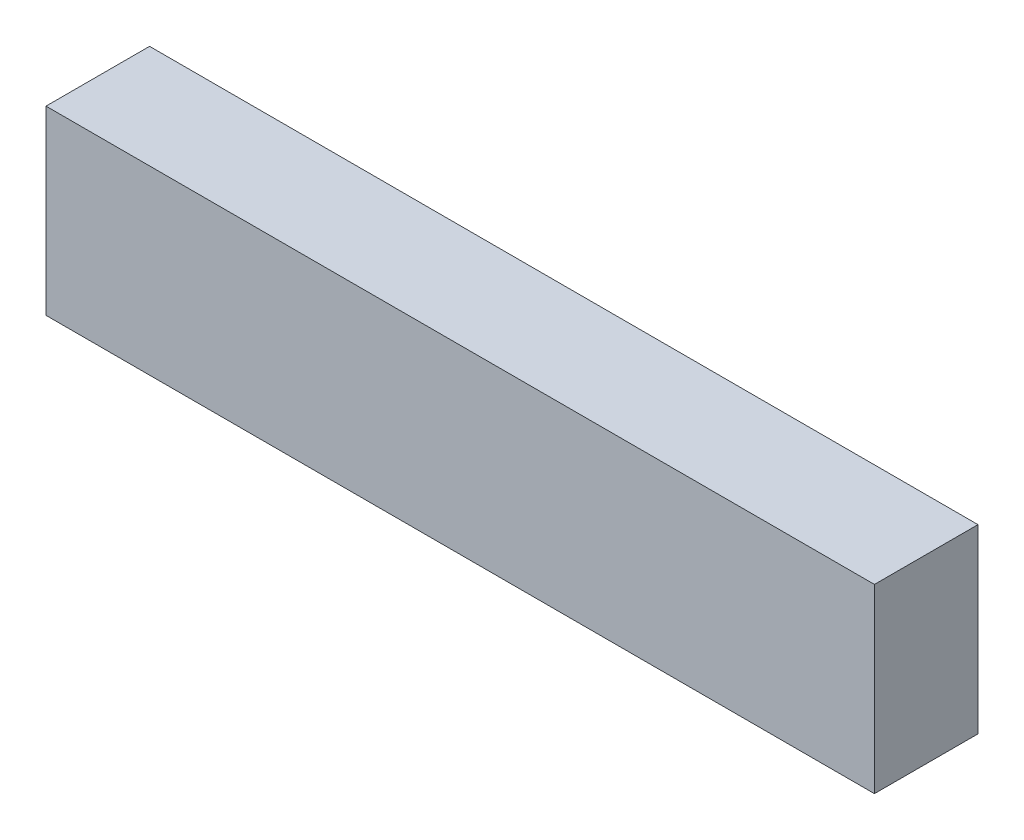
ISO-10303-21;
HEADER;
FILE_DESCRIPTION(('STEP AP214'),'2;1');
FILE_NAME('part.step','',(''),(''),'','','');
FILE_SCHEMA(('AUTOMOTIVE_DESIGN { 1 0 10303 214 1 1 1 1 }'));
ENDSEC;
DATA;
#1=APPLICATION_CONTEXT('core data for automotive mechanical design processes');
#2=APPLICATION_PROTOCOL_DEFINITION('international standard','automotive_design',2000,#1);
#3=PRODUCT_CONTEXT('',#1,'mechanical');
#4=PRODUCT('Part','Part','',(#3));
#5=PRODUCT_RELATED_PRODUCT_CATEGORY('part','',(#4));
#6=PRODUCT_DEFINITION_FORMATION('','',#4);
#7=PRODUCT_DEFINITION_CONTEXT('part definition',#1,'design');
#8=PRODUCT_DEFINITION('design','',#6,#7);
#9=PRODUCT_DEFINITION_SHAPE('','',#8);
#10=(LENGTH_UNIT() NAMED_UNIT(*) SI_UNIT(.MILLI.,.METRE.));
#11=(NAMED_UNIT(*) PLANE_ANGLE_UNIT() SI_UNIT($,.RADIAN.));
#12=(NAMED_UNIT(*) SI_UNIT($,.STERADIAN.) SOLID_ANGLE_UNIT());
#13=UNCERTAINTY_MEASURE_WITH_UNIT(LENGTH_MEASURE(1.E-05),#10,'distance_accuracy_value','');
#14=(GEOMETRIC_REPRESENTATION_CONTEXT(3) GLOBAL_UNCERTAINTY_ASSIGNED_CONTEXT((#13)) GLOBAL_UNIT_ASSIGNED_CONTEXT((#10,
#11,#12)) REPRESENTATION_CONTEXT('',''));
#15=CARTESIAN_POINT('',(0.,0.,0.));
#16=DIRECTION('',(0.,0.,1.));
#17=DIRECTION('',(1.,0.,0.));
#18=AXIS2_PLACEMENT_3D('',#15,#16,#17);
#19=CARTESIAN_POINT('',(108.,8.5,-48.8439995269952));
#20=DIRECTION('',(1.,0.,0.));
#21=DIRECTION('',(0.,0.,-1.));
#22=AXIS2_PLACEMENT_3D('',#19,#20,#21);
#23=PLANE('',#22);
#24=DIRECTION('',(0.,0.,1.));
#25=VECTOR('',#24,1.);
#26=CARTESIAN_POINT('',(108.,1.5,-48.8439995269952));
#27=LINE('',#26,#25);
#28=CARTESIAN_POINT('',(108.,1.5,-48.8439995269952));
#29=VERTEX_POINT('',#28);
#30=CARTESIAN_POINT('',(108.,1.5,-44.8439995269949));
#31=VERTEX_POINT('',#30);
#32=EDGE_CURVE('E99',#29,#31,#27,.T.);
#33=ORIENTED_EDGE('',*,*,#32,.T.);
#34=DIRECTION('',(0.,-1.,0.));
#35=VECTOR('',#34,1.);
#36=CARTESIAN_POINT('',(108.,8.5,-44.8439995269949));
#37=LINE('',#36,#35);
#38=CARTESIAN_POINT('',(108.,8.5,-44.8439995269949));
#39=VERTEX_POINT('',#38);
#40=EDGE_CURVE('E97',#39,#31,#37,.T.);
#41=ORIENTED_EDGE('',*,*,#40,.F.);
#42=DIRECTION('',(0.,0.,1.));
#43=VECTOR('',#42,1.);
#44=CARTESIAN_POINT('',(108.,8.5,-48.8439995269952));
#45=LINE('',#44,#43);
#46=CARTESIAN_POINT('',(108.,8.5,-48.8439995269952));
#47=VERTEX_POINT('',#46);
#48=EDGE_CURVE('E104',#47,#39,#45,.T.);
#49=ORIENTED_EDGE('',*,*,#48,.F.);
#50=DIRECTION('',(0.,-1.,0.));
#51=VECTOR('',#50,1.);
#52=CARTESIAN_POINT('',(108.,8.5,-48.8439995269952));
#53=LINE('',#52,#51);
#54=EDGE_CURVE('E102',#47,#29,#53,.T.);
#55=ORIENTED_EDGE('',*,*,#54,.T.);
#56=EDGE_LOOP('',(#33,#41,#49,#55));
#57=FACE_BOUND('',#56,.T.);
#58=ADVANCED_FACE('F45',(#57),#23,.F.);
#59=CARTESIAN_POINT('',(140.,8.5,-44.8439995269952));
#60=DIRECTION('',(0.,0.,-1.));
#61=DIRECTION('',(-1.,0.,0.));
#62=AXIS2_PLACEMENT_3D('',#59,#60,#61);
#63=PLANE('',#62);
#64=DIRECTION('',(1.,0.,0.));
#65=VECTOR('',#64,1.);
#66=CARTESIAN_POINT('',(140.,1.5,-44.8439995269952));
#67=LINE('',#66,#65);
#68=CARTESIAN_POINT('',(140.,1.5,-44.8439995269952));
#69=VERTEX_POINT('',#68);
#70=EDGE_CURVE('E83',#31,#69,#67,.T.);
#71=ORIENTED_EDGE('',*,*,#70,.T.);
#72=DIRECTION('',(0.,-1.,0.));
#73=VECTOR('',#72,1.);
#74=CARTESIAN_POINT('',(140.,8.5,-44.8439995269952));
#75=LINE('',#74,#73);
#76=CARTESIAN_POINT('',(140.,8.5,-44.8439995269952));
#77=VERTEX_POINT('',#76);
#78=EDGE_CURVE('E94',#77,#69,#75,.T.);
#79=ORIENTED_EDGE('',*,*,#78,.F.);
#80=DIRECTION('',(1.,0.,0.));
#81=VECTOR('',#80,1.);
#82=CARTESIAN_POINT('',(140.,8.5,-44.8439995269952));
#83=LINE('',#82,#81);
#84=EDGE_CURVE('E61',#39,#77,#83,.T.);
#85=ORIENTED_EDGE('',*,*,#84,.F.);
#86=ORIENTED_EDGE('',*,*,#40,.T.);
#87=EDGE_LOOP('',(#71,#79,#85,#86));
#88=FACE_BOUND('',#87,.T.);
#89=ADVANCED_FACE('F93',(#88),#63,.F.);
#90=CARTESIAN_POINT('',(0.,8.5,0.));
#91=DIRECTION('',(0.,-1.,0.));
#92=DIRECTION('',(0.,0.,-1.));
#93=AXIS2_PLACEMENT_3D('',#90,#91,#92);
#94=PLANE('',#93);
#95=DIRECTION('',(0.,0.,-1.));
#96=VECTOR('',#95,1.);
#97=CARTESIAN_POINT('',(140.,8.5,-48.8439995269953));
#98=LINE('',#97,#96);
#99=CARTESIAN_POINT('',(140.,8.5,-48.8439995269953));
#100=VERTEX_POINT('',#99);
#101=EDGE_CURVE('E98',#77,#100,#98,.T.);
#102=ORIENTED_EDGE('',*,*,#101,.T.);
#103=DIRECTION('',(-1.,0.,0.));
#104=VECTOR('',#103,1.);
#105=CARTESIAN_POINT('',(140.,8.5,-48.8439995269953));
#106=LINE('',#105,#104);
#107=EDGE_CURVE('E112',#100,#47,#106,.T.);
#108=ORIENTED_EDGE('',*,*,#107,.T.);
#109=ORIENTED_EDGE('',*,*,#48,.T.);
#110=ORIENTED_EDGE('',*,*,#84,.T.);
#111=EDGE_LOOP('',(#102,#108,#109,#110));
#112=FACE_BOUND('',#111,.T.);
#113=ADVANCED_FACE('F115',(#112),#94,.F.);
#114=CARTESIAN_POINT('',(140.,8.5,-48.8439995269953));
#115=DIRECTION('',(0.,0.,1.));
#116=DIRECTION('',(1.,0.,0.));
#117=AXIS2_PLACEMENT_3D('',#114,#115,#116);
#118=PLANE('',#117);
#119=DIRECTION('',(-1.,0.,0.));
#120=VECTOR('',#119,1.);
#121=CARTESIAN_POINT('',(140.,1.5,-48.8439995269953));
#122=LINE('',#121,#120);
#123=CARTESIAN_POINT('',(140.,1.5,-48.8439995269953));
#124=VERTEX_POINT('',#123);
#125=EDGE_CURVE('E86',#124,#29,#122,.T.);
#126=ORIENTED_EDGE('',*,*,#125,.T.);
#127=ORIENTED_EDGE('',*,*,#54,.F.);
#128=ORIENTED_EDGE('',*,*,#107,.F.);
#129=DIRECTION('',(0.,-1.,0.));
#130=VECTOR('',#129,1.);
#131=CARTESIAN_POINT('',(140.,8.5,-48.8439995269953));
#132=LINE('',#131,#130);
#133=EDGE_CURVE('E54',#100,#124,#132,.T.);
#134=ORIENTED_EDGE('',*,*,#133,.T.);
#135=EDGE_LOOP('',(#126,#127,#128,#134));
#136=FACE_BOUND('',#135,.T.);
#137=ADVANCED_FACE('F110',(#136),#118,.F.);
#138=CARTESIAN_POINT('',(140.,1.5,140.));
#139=DIRECTION('',(-1.,0.,0.));
#140=DIRECTION('',(0.,0.,1.));
#141=AXIS2_PLACEMENT_3D('',#138,#139,#140);
#142=PLANE('',#141);
#143=ORIENTED_EDGE('',*,*,#78,.T.);
#144=DIRECTION('',(0.,0.,-1.));
#145=VECTOR('',#144,1.);
#146=CARTESIAN_POINT('',(140.,1.5,140.));
#147=LINE('',#146,#145);
#148=EDGE_CURVE('E11',#69,#124,#147,.T.);
#149=ORIENTED_EDGE('',*,*,#148,.T.);
#150=ORIENTED_EDGE('',*,*,#133,.F.);
#151=ORIENTED_EDGE('',*,*,#101,.F.);
#152=EDGE_LOOP('',(#143,#149,#150,#151));
#153=FACE_BOUND('',#152,.T.);
#154=ADVANCED_FACE('F47',(#153),#142,.F.);
#155=CARTESIAN_POINT('',(105.209229017815,1.5,-53.6517996771633));
#156=DIRECTION('',(0.,1.,0.));
#157=DIRECTION('',(0.,0.,1.));
#158=AXIS2_PLACEMENT_3D('',#155,#156,#157);
#159=PLANE('',#158);
#160=ORIENTED_EDGE('',*,*,#32,.F.);
#161=ORIENTED_EDGE('',*,*,#125,.F.);
#162=ORIENTED_EDGE('',*,*,#148,.F.);
#163=ORIENTED_EDGE('',*,*,#70,.F.);
#164=EDGE_LOOP('',(#160,#161,#162,#163));
#165=FACE_BOUND('',#164,.T.);
#166=ADVANCED_FACE('F82',(#165),#159,.F.);
#167=CLOSED_SHELL('',(#58,#89,#113,#137,#154,#166));
#168=MANIFOLD_SOLID_BREP('B2',#167);
#169=ADVANCED_BREP_SHAPE_REPRESENTATION('',(#18,#168),#14);
#170=SHAPE_DEFINITION_REPRESENTATION(#9,#169);
ENDSEC;
END-ISO-10303-21;
